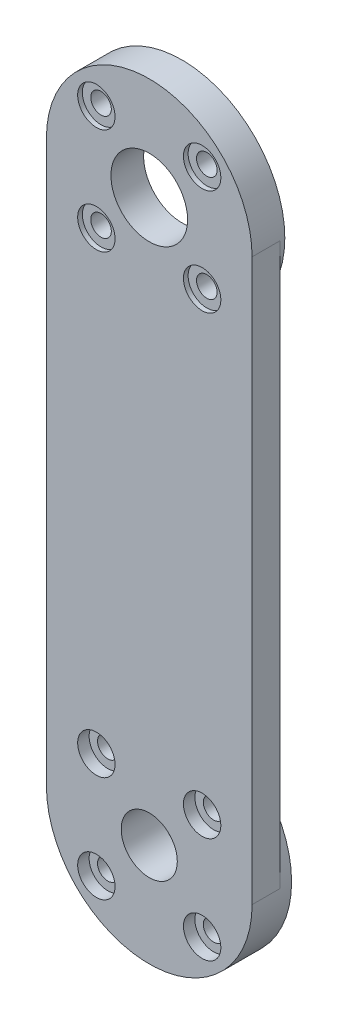
ISO-10303-21;
HEADER;
FILE_DESCRIPTION(('STEP AP214'),'2;1');
FILE_NAME('part.step','',(''),(''),'','','');
FILE_SCHEMA(('AUTOMOTIVE_DESIGN { 1 0 10303 214 1 1 1 1 }'));
ENDSEC;
DATA;
#1=APPLICATION_CONTEXT('core data for automotive mechanical design processes');
#2=APPLICATION_PROTOCOL_DEFINITION('international standard','automotive_design',2000,#1);
#3=PRODUCT_CONTEXT('',#1,'mechanical');
#4=PRODUCT('Part','Part','',(#3));
#5=PRODUCT_RELATED_PRODUCT_CATEGORY('part','',(#4));
#6=PRODUCT_DEFINITION_FORMATION('','',#4);
#7=PRODUCT_DEFINITION_CONTEXT('part definition',#1,'design');
#8=PRODUCT_DEFINITION('design','',#6,#7);
#9=PRODUCT_DEFINITION_SHAPE('','',#8);
#10=(LENGTH_UNIT() NAMED_UNIT(*) SI_UNIT(.MILLI.,.METRE.));
#11=(NAMED_UNIT(*) PLANE_ANGLE_UNIT() SI_UNIT($,.RADIAN.));
#12=(NAMED_UNIT(*) SI_UNIT($,.STERADIAN.) SOLID_ANGLE_UNIT());
#13=UNCERTAINTY_MEASURE_WITH_UNIT(LENGTH_MEASURE(1.E-05),#10,'distance_accuracy_value','');
#14=(GEOMETRIC_REPRESENTATION_CONTEXT(3) GLOBAL_UNCERTAINTY_ASSIGNED_CONTEXT((#13)) GLOBAL_UNIT_ASSIGNED_CONTEXT((#10,
#11,#12)) REPRESENTATION_CONTEXT('',''));
#15=CARTESIAN_POINT('',(0.,0.,0.));
#16=DIRECTION('',(0.,0.,1.));
#17=DIRECTION('',(1.,0.,0.));
#18=AXIS2_PLACEMENT_3D('',#15,#16,#17);
#19=CARTESIAN_POINT('',(-5.65685424949239,-35.6568542494924,-9.71028137423857));
#20=DIRECTION('',(0.,0.,1.));
#21=DIRECTION('',(1.,0.,0.));
#22=AXIS2_PLACEMENT_3D('',#19,#20,#21);
#23=CYLINDRICAL_SURFACE('',#22,1.1);
#24=CARTESIAN_POINT('',(-5.65685424949239,-35.6568542494924,-1.225));
#25=DIRECTION('',(0.,0.,1.));
#26=DIRECTION('',(1.,0.,0.));
#27=AXIS2_PLACEMENT_3D('',#24,#25,#26);
#28=CIRCLE('',#27,1.1);
#29=CARTESIAN_POINT('',(-4.55685424949239,-35.6568542494924,-1.225));
#30=VERTEX_POINT('',#29);
#31=EDGE_CURVE('E241',#30,#30,#28,.F.);
#32=ORIENTED_EDGE('',*,*,#31,.T.);
#33=EDGE_LOOP('',(#32));
#34=FACE_BOUND('',#33,.T.);
#35=CARTESIAN_POINT('',(-5.65685424949239,-35.6568542494924,1.775));
#36=DIRECTION('',(0.,0.,1.));
#37=DIRECTION('',(1.,0.,0.));
#38=AXIS2_PLACEMENT_3D('',#35,#36,#37);
#39=CIRCLE('',#38,1.1);
#40=CARTESIAN_POINT('',(-4.55685424949239,-35.6568542494924,1.775));
#41=VERTEX_POINT('',#40);
#42=EDGE_CURVE('E262',#41,#41,#39,.F.);
#43=ORIENTED_EDGE('',*,*,#42,.F.);
#44=EDGE_LOOP('',(#43));
#45=FACE_BOUND('',#44,.T.);
#46=ADVANCED_FACE('F43',(#34,#45),#23,.F.);
#47=CARTESIAN_POINT('',(-5.65685424949239,-24.3431457505076,-9.71028137423857));
#48=DIRECTION('',(0.,0.,1.));
#49=DIRECTION('',(1.,0.,0.));
#50=AXIS2_PLACEMENT_3D('',#47,#48,#49);
#51=CYLINDRICAL_SURFACE('',#50,1.1);
#52=CARTESIAN_POINT('',(-5.65685424949239,-24.3431457505076,-1.225));
#53=DIRECTION('',(0.,0.,1.));
#54=DIRECTION('',(1.,0.,0.));
#55=AXIS2_PLACEMENT_3D('',#52,#53,#54);
#56=CIRCLE('',#55,1.1);
#57=CARTESIAN_POINT('',(-4.55685424949239,-24.3431457505076,-1.225));
#58=VERTEX_POINT('',#57);
#59=EDGE_CURVE('E233',#58,#58,#56,.F.);
#60=ORIENTED_EDGE('',*,*,#59,.T.);
#61=EDGE_LOOP('',(#60));
#62=FACE_BOUND('',#61,.T.);
#63=CARTESIAN_POINT('',(-5.65685424949239,-24.3431457505076,1.775));
#64=DIRECTION('',(0.,0.,1.));
#65=DIRECTION('',(1.,0.,0.));
#66=AXIS2_PLACEMENT_3D('',#63,#64,#65);
#67=CIRCLE('',#66,1.1);
#68=CARTESIAN_POINT('',(-4.55685424949239,-24.3431457505076,1.775));
#69=VERTEX_POINT('',#68);
#70=EDGE_CURVE('E242',#69,#69,#67,.F.);
#71=ORIENTED_EDGE('',*,*,#70,.F.);
#72=EDGE_LOOP('',(#71));
#73=FACE_BOUND('',#72,.T.);
#74=ADVANCED_FACE('F295',(#62,#73),#51,.F.);
#75=CARTESIAN_POINT('',(5.65685424949243,-35.6568542494923,-9.71028137423857));
#76=DIRECTION('',(0.,0.,1.));
#77=DIRECTION('',(1.,0.,0.));
#78=AXIS2_PLACEMENT_3D('',#75,#76,#77);
#79=CYLINDRICAL_SURFACE('',#78,1.1);
#80=CARTESIAN_POINT('',(5.65685424949243,-35.6568542494923,-1.225));
#81=DIRECTION('',(0.,0.,1.));
#82=DIRECTION('',(1.,0.,0.));
#83=AXIS2_PLACEMENT_3D('',#80,#81,#82);
#84=CIRCLE('',#83,1.1);
#85=CARTESIAN_POINT('',(6.75685424949243,-35.6568542494923,-1.225));
#86=VERTEX_POINT('',#85);
#87=EDGE_CURVE('E237',#86,#86,#84,.F.);
#88=ORIENTED_EDGE('',*,*,#87,.T.);
#89=EDGE_LOOP('',(#88));
#90=FACE_BOUND('',#89,.T.);
#91=CARTESIAN_POINT('',(5.65685424949243,-35.6568542494923,1.775));
#92=DIRECTION('',(0.,0.,1.));
#93=DIRECTION('',(1.,0.,0.));
#94=AXIS2_PLACEMENT_3D('',#91,#92,#93);
#95=CIRCLE('',#94,1.1);
#96=CARTESIAN_POINT('',(6.75685424949243,-35.6568542494923,1.775));
#97=VERTEX_POINT('',#96);
#98=EDGE_CURVE('E249',#97,#97,#95,.F.);
#99=ORIENTED_EDGE('',*,*,#98,.F.);
#100=EDGE_LOOP('',(#99));
#101=FACE_BOUND('',#100,.T.);
#102=ADVANCED_FACE('F297',(#90,#101),#79,.F.);
#103=CARTESIAN_POINT('',(5.65685424949239,-24.3431457505076,-9.71028137423857));
#104=DIRECTION('',(0.,0.,1.));
#105=DIRECTION('',(1.,0.,0.));
#106=AXIS2_PLACEMENT_3D('',#103,#104,#105);
#107=CYLINDRICAL_SURFACE('',#106,1.1);
#108=CARTESIAN_POINT('',(5.65685424949239,-24.3431457505076,-1.225));
#109=DIRECTION('',(0.,0.,1.));
#110=DIRECTION('',(1.,0.,0.));
#111=AXIS2_PLACEMENT_3D('',#108,#109,#110);
#112=CIRCLE('',#111,1.1);
#113=CARTESIAN_POINT('',(6.75685424949239,-24.3431457505076,-1.225));
#114=VERTEX_POINT('',#113);
#115=EDGE_CURVE('E213',#114,#114,#112,.F.);
#116=ORIENTED_EDGE('',*,*,#115,.T.);
#117=EDGE_LOOP('',(#116));
#118=FACE_BOUND('',#117,.T.);
#119=CARTESIAN_POINT('',(5.65685424949239,-24.3431457505076,1.775));
#120=DIRECTION('',(0.,0.,1.));
#121=DIRECTION('',(1.,0.,0.));
#122=AXIS2_PLACEMENT_3D('',#119,#120,#121);
#123=CIRCLE('',#122,1.1);
#124=CARTESIAN_POINT('',(6.75685424949239,-24.3431457505076,1.775));
#125=VERTEX_POINT('',#124);
#126=EDGE_CURVE('E218',#125,#125,#123,.F.);
#127=ORIENTED_EDGE('',*,*,#126,.F.);
#128=EDGE_LOOP('',(#127));
#129=FACE_BOUND('',#128,.T.);
#130=ADVANCED_FACE('F304',(#118,#129),#107,.F.);
#131=CARTESIAN_POINT('',(-5.65685424949236,24.3431457505076,-12.0965512114594));
#132=DIRECTION('',(0.,0.,1.));
#133=DIRECTION('',(1.,0.,0.));
#134=AXIS2_PLACEMENT_3D('',#131,#132,#133);
#135=CYLINDRICAL_SURFACE('',#134,1.10000000000001);
#136=CARTESIAN_POINT('',(-5.65685424949236,24.3431457505076,-0.5));
#137=DIRECTION('',(0.,0.,1.));
#138=DIRECTION('',(1.,0.,0.));
#139=AXIS2_PLACEMENT_3D('',#136,#137,#138);
#140=CIRCLE('',#139,1.10000000000001);
#141=CARTESIAN_POINT('',(-4.55685424949235,24.3431457505076,-0.5));
#142=VERTEX_POINT('',#141);
#143=EDGE_CURVE('E163',#142,#142,#140,.F.);
#144=ORIENTED_EDGE('',*,*,#143,.T.);
#145=EDGE_LOOP('',(#144));
#146=FACE_BOUND('',#145,.T.);
#147=CARTESIAN_POINT('',(-5.65685424949236,24.3431457505076,2.5));
#148=DIRECTION('',(0.,0.,1.));
#149=DIRECTION('',(1.,0.,0.));
#150=AXIS2_PLACEMENT_3D('',#147,#148,#149);
#151=CIRCLE('',#150,1.10000000000001);
#152=CARTESIAN_POINT('',(-4.55685424949235,24.3431457505076,2.5));
#153=VERTEX_POINT('',#152);
#154=EDGE_CURVE('E175',#153,#153,#151,.F.);
#155=ORIENTED_EDGE('',*,*,#154,.F.);
#156=EDGE_LOOP('',(#155));
#157=FACE_BOUND('',#156,.T.);
#158=ADVANCED_FACE('F327',(#146,#157),#135,.F.);
#159=CARTESIAN_POINT('',(-5.65685424949243,35.6568542494923,-12.0965512114594));
#160=DIRECTION('',(0.,0.,1.));
#161=DIRECTION('',(1.,0.,0.));
#162=AXIS2_PLACEMENT_3D('',#159,#160,#161);
#163=CYLINDRICAL_SURFACE('',#162,1.10000000000001);
#164=CARTESIAN_POINT('',(-5.65685424949243,35.6568542494923,-0.5));
#165=DIRECTION('',(0.,0.,1.));
#166=DIRECTION('',(1.,0.,0.));
#167=AXIS2_PLACEMENT_3D('',#164,#165,#166);
#168=CIRCLE('',#167,1.10000000000001);
#169=CARTESIAN_POINT('',(-4.55685424949242,35.6568542494923,-0.5));
#170=VERTEX_POINT('',#169);
#171=EDGE_CURVE('E155',#170,#170,#168,.F.);
#172=ORIENTED_EDGE('',*,*,#171,.T.);
#173=EDGE_LOOP('',(#172));
#174=FACE_BOUND('',#173,.T.);
#175=CARTESIAN_POINT('',(-5.65685424949243,35.6568542494923,2.5));
#176=DIRECTION('',(0.,0.,1.));
#177=DIRECTION('',(1.,0.,0.));
#178=AXIS2_PLACEMENT_3D('',#175,#176,#177);
#179=CIRCLE('',#178,1.10000000000001);
#180=CARTESIAN_POINT('',(-4.55685424949242,35.6568542494923,2.5));
#181=VERTEX_POINT('',#180);
#182=EDGE_CURVE('E189',#181,#181,#179,.F.);
#183=ORIENTED_EDGE('',*,*,#182,.F.);
#184=EDGE_LOOP('',(#183));
#185=FACE_BOUND('',#184,.T.);
#186=ADVANCED_FACE('F359',(#174,#185),#163,.F.);
#187=CARTESIAN_POINT('',(5.65685424949246,24.3431457505077,-12.0965512114594));
#188=DIRECTION('',(0.,0.,1.));
#189=DIRECTION('',(1.,0.,0.));
#190=AXIS2_PLACEMENT_3D('',#187,#188,#189);
#191=CYLINDRICAL_SURFACE('',#190,1.10000000000001);
#192=CARTESIAN_POINT('',(5.65685424949246,24.3431457505077,-0.5));
#193=DIRECTION('',(0.,0.,1.));
#194=DIRECTION('',(1.,0.,0.));
#195=AXIS2_PLACEMENT_3D('',#192,#193,#194);
#196=CIRCLE('',#195,1.10000000000001);
#197=CARTESIAN_POINT('',(6.75685424949247,24.3431457505077,-0.5));
#198=VERTEX_POINT('',#197);
#199=EDGE_CURVE('E159',#198,#198,#196,.F.);
#200=ORIENTED_EDGE('',*,*,#199,.T.);
#201=EDGE_LOOP('',(#200));
#202=FACE_BOUND('',#201,.T.);
#203=CARTESIAN_POINT('',(5.65685424949246,24.3431457505077,2.5));
#204=DIRECTION('',(0.,0.,1.));
#205=DIRECTION('',(1.,0.,0.));
#206=AXIS2_PLACEMENT_3D('',#203,#204,#205);
#207=CIRCLE('',#206,1.10000000000001);
#208=CARTESIAN_POINT('',(6.75685424949247,24.3431457505077,2.5));
#209=VERTEX_POINT('',#208);
#210=EDGE_CURVE('E177',#209,#209,#207,.F.);
#211=ORIENTED_EDGE('',*,*,#210,.F.);
#212=EDGE_LOOP('',(#211));
#213=FACE_BOUND('',#212,.T.);
#214=ADVANCED_FACE('F363',(#202,#213),#191,.F.);
#215=CARTESIAN_POINT('',(5.65685424949235,35.6568542494924,-12.0965512114594));
#216=DIRECTION('',(0.,0.,1.));
#217=DIRECTION('',(1.,0.,0.));
#218=AXIS2_PLACEMENT_3D('',#215,#216,#217);
#219=CYLINDRICAL_SURFACE('',#218,1.10000000000001);
#220=CARTESIAN_POINT('',(5.65685424949235,35.6568542494924,-0.5));
#221=DIRECTION('',(0.,0.,1.));
#222=DIRECTION('',(1.,0.,0.));
#223=AXIS2_PLACEMENT_3D('',#220,#221,#222);
#224=CIRCLE('',#223,1.10000000000001);
#225=CARTESIAN_POINT('',(6.75685424949235,35.6568542494924,-0.5));
#226=VERTEX_POINT('',#225);
#227=EDGE_CURVE('E135',#226,#226,#224,.F.);
#228=ORIENTED_EDGE('',*,*,#227,.T.);
#229=EDGE_LOOP('',(#228));
#230=FACE_BOUND('',#229,.T.);
#231=CARTESIAN_POINT('',(5.65685424949235,35.6568542494924,2.5));
#232=DIRECTION('',(0.,0.,1.));
#233=DIRECTION('',(1.,0.,0.));
#234=AXIS2_PLACEMENT_3D('',#231,#232,#233);
#235=CIRCLE('',#234,1.10000000000001);
#236=CARTESIAN_POINT('',(6.75685424949235,35.6568542494924,2.5));
#237=VERTEX_POINT('',#236);
#238=EDGE_CURVE('E151',#237,#237,#235,.F.);
#239=ORIENTED_EDGE('',*,*,#238,.F.);
#240=EDGE_LOOP('',(#239));
#241=FACE_BOUND('',#240,.T.);
#242=ADVANCED_FACE('F367',(#230,#241),#219,.F.);
#243=CARTESIAN_POINT('',(11.,0.,3.));
#244=DIRECTION('',(1.,0.,0.));
#245=DIRECTION('',(0.,1.,0.));
#246=AXIS2_PLACEMENT_3D('',#243,#244,#245);
#247=PLANE('',#246);
#248=DIRECTION('',(0.,-1.,0.));
#249=VECTOR('',#248,1.);
#250=CARTESIAN_POINT('',(11.,0.,0.));
#251=LINE('',#250,#249);
#252=CARTESIAN_POINT('',(11.,30.,0.));
#253=VERTEX_POINT('',#252);
#254=CARTESIAN_POINT('',(11.,-30.,0.));
#255=VERTEX_POINT('',#254);
#256=EDGE_CURVE('E112',#253,#255,#251,.T.);
#257=ORIENTED_EDGE('',*,*,#256,.F.);
#258=DIRECTION('',(0.,0.,-1.));
#259=VECTOR('',#258,1.);
#260=CARTESIAN_POINT('',(11.,30.,3.));
#261=LINE('',#260,#259);
#262=CARTESIAN_POINT('',(11.,30.,3.));
#263=VERTEX_POINT('',#262);
#264=EDGE_CURVE('E47',#263,#253,#261,.T.);
#265=ORIENTED_EDGE('',*,*,#264,.F.);
#266=DIRECTION('',(0.,-1.,0.));
#267=VECTOR('',#266,1.);
#268=CARTESIAN_POINT('',(11.,0.,3.));
#269=LINE('',#268,#267);
#270=CARTESIAN_POINT('',(11.,-30.,3.));
#271=VERTEX_POINT('',#270);
#272=EDGE_CURVE('E93',#263,#271,#269,.T.);
#273=ORIENTED_EDGE('',*,*,#272,.T.);
#274=DIRECTION('',(0.,0.,-1.));
#275=VECTOR('',#274,1.);
#276=CARTESIAN_POINT('',(11.,-30.,3.));
#277=LINE('',#276,#275);
#278=EDGE_CURVE('E108',#271,#255,#277,.T.);
#279=ORIENTED_EDGE('',*,*,#278,.T.);
#280=EDGE_LOOP('',(#257,#265,#273,#279));
#281=FACE_BOUND('',#280,.T.);
#282=ADVANCED_FACE('F45',(#281),#247,.T.);
#283=CARTESIAN_POINT('',(0.,30.,3.));
#284=DIRECTION('',(0.,0.,-1.));
#285=DIRECTION('',(-1.,0.,0.));
#286=AXIS2_PLACEMENT_3D('',#283,#284,#285);
#287=CYLINDRICAL_SURFACE('',#286,11.);
#288=ORIENTED_EDGE('',*,*,#264,.T.);
#289=CARTESIAN_POINT('',(0.,30.,0.));
#290=DIRECTION('',(0.,0.,1.));
#291=DIRECTION('',(1.,0.,0.));
#292=AXIS2_PLACEMENT_3D('',#289,#290,#291);
#293=CIRCLE('',#292,11.);
#294=CARTESIAN_POINT('',(-11.,30.,0.));
#295=VERTEX_POINT('',#294);
#296=EDGE_CURVE('E12',#295,#253,#293,.T.);
#297=ORIENTED_EDGE('',*,*,#296,.F.);
#298=DIRECTION('',(0.,0.,-1.));
#299=VECTOR('',#298,1.);
#300=CARTESIAN_POINT('',(-11.,30.,3.));
#301=LINE('',#300,#299);
#302=CARTESIAN_POINT('',(-11.,30.,3.));
#303=VERTEX_POINT('',#302);
#304=EDGE_CURVE('E96',#303,#295,#301,.T.);
#305=ORIENTED_EDGE('',*,*,#304,.F.);
#306=CARTESIAN_POINT('',(0.,30.,3.));
#307=DIRECTION('',(0.,0.,1.));
#308=DIRECTION('',(1.,0.,0.));
#309=AXIS2_PLACEMENT_3D('',#306,#307,#308);
#310=CIRCLE('',#309,11.);
#311=EDGE_CURVE('E87',#263,#303,#310,.T.);
#312=ORIENTED_EDGE('',*,*,#311,.F.);
#313=EDGE_LOOP('',(#288,#297,#305,#312));
#314=FACE_BOUND('',#313,.T.);
#315=CARTESIAN_POINT('',(0.,30.,-0.5));
#316=DIRECTION('',(0.,0.,1.));
#317=DIRECTION('',(1.,0.,0.));
#318=AXIS2_PLACEMENT_3D('',#315,#316,#317);
#319=CIRCLE('',#318,11.);
#320=CARTESIAN_POINT('',(11.,30.,-0.5));
#321=VERTEX_POINT('',#320);
#322=EDGE_CURVE('E116',#321,#321,#319,.T.);
#323=ORIENTED_EDGE('',*,*,#322,.T.);
#324=EDGE_LOOP('',(#323));
#325=FACE_BOUND('',#324,.T.);
#326=ADVANCED_FACE('F97',(#314,#325),#287,.T.);
#327=CARTESIAN_POINT('',(-11.,0.,3.));
#328=DIRECTION('',(1.,0.,0.));
#329=DIRECTION('',(0.,1.,0.));
#330=AXIS2_PLACEMENT_3D('',#327,#328,#329);
#331=PLANE('',#330);
#332=DIRECTION('',(0.,-1.,0.));
#333=VECTOR('',#332,1.);
#334=CARTESIAN_POINT('',(-11.,0.,0.));
#335=LINE('',#334,#333);
#336=CARTESIAN_POINT('',(-11.,-30.,0.));
#337=VERTEX_POINT('',#336);
#338=EDGE_CURVE('E115',#295,#337,#335,.T.);
#339=ORIENTED_EDGE('',*,*,#338,.T.);
#340=DIRECTION('',(0.,0.,-1.));
#341=VECTOR('',#340,1.);
#342=CARTESIAN_POINT('',(-11.,-30.,3.));
#343=LINE('',#342,#341);
#344=CARTESIAN_POINT('',(-11.,-30.,3.));
#345=VERTEX_POINT('',#344);
#346=EDGE_CURVE('E102',#345,#337,#343,.T.);
#347=ORIENTED_EDGE('',*,*,#346,.F.);
#348=DIRECTION('',(0.,-1.,0.));
#349=VECTOR('',#348,1.);
#350=CARTESIAN_POINT('',(-11.,0.,3.));
#351=LINE('',#350,#349);
#352=EDGE_CURVE('E90',#303,#345,#351,.T.);
#353=ORIENTED_EDGE('',*,*,#352,.F.);
#354=ORIENTED_EDGE('',*,*,#304,.T.);
#355=EDGE_LOOP('',(#339,#347,#353,#354));
#356=FACE_BOUND('',#355,.T.);
#357=ADVANCED_FACE('F103',(#356),#331,.F.);
#358=CARTESIAN_POINT('',(0.,-30.,3.));
#359=DIRECTION('',(0.,0.,-1.));
#360=DIRECTION('',(-1.,0.,0.));
#361=AXIS2_PLACEMENT_3D('',#358,#359,#360);
#362=CYLINDRICAL_SURFACE('',#361,11.);
#363=ORIENTED_EDGE('',*,*,#346,.T.);
#364=CARTESIAN_POINT('',(0.,-30.,0.));
#365=DIRECTION('',(0.,0.,1.));
#366=DIRECTION('',(1.,0.,0.));
#367=AXIS2_PLACEMENT_3D('',#364,#365,#366);
#368=CIRCLE('',#367,11.);
#369=EDGE_CURVE('E126',#255,#337,#368,.T.);
#370=ORIENTED_EDGE('',*,*,#369,.F.);
#371=ORIENTED_EDGE('',*,*,#278,.F.);
#372=CARTESIAN_POINT('',(0.,-30.,3.));
#373=DIRECTION('',(0.,0.,1.));
#374=DIRECTION('',(1.,0.,0.));
#375=AXIS2_PLACEMENT_3D('',#372,#373,#374);
#376=CIRCLE('',#375,11.);
#377=EDGE_CURVE('E62',#345,#271,#376,.T.);
#378=ORIENTED_EDGE('',*,*,#377,.F.);
#379=EDGE_LOOP('',(#363,#370,#371,#378));
#380=FACE_BOUND('',#379,.T.);
#381=CARTESIAN_POINT('',(0.,-30.,-1.225));
#382=DIRECTION('',(0.,0.,1.));
#383=DIRECTION('',(1.,0.,0.));
#384=AXIS2_PLACEMENT_3D('',#381,#382,#383);
#385=CIRCLE('',#384,11.);
#386=CARTESIAN_POINT('',(11.,-30.,-1.225));
#387=VERTEX_POINT('',#386);
#388=EDGE_CURVE('E181',#387,#387,#385,.T.);
#389=ORIENTED_EDGE('',*,*,#388,.T.);
#390=EDGE_LOOP('',(#389));
#391=FACE_BOUND('',#390,.T.);
#392=ADVANCED_FACE('F124',(#380,#391),#362,.T.);
#393=CARTESIAN_POINT('',(0.,0.,3.));
#394=DIRECTION('',(0.,0.,1.));
#395=DIRECTION('',(1.,0.,0.));
#396=AXIS2_PLACEMENT_3D('',#393,#394,#395);
#397=PLANE('',#396);
#398=CARTESIAN_POINT('',(-5.65685424949239,-24.3431457505076,3.));
#399=DIRECTION('',(0.,0.,1.));
#400=DIRECTION('',(0.,1.,0.));
#401=AXIS2_PLACEMENT_3D('',#398,#399,#400);
#402=CIRCLE('',#401,2.);
#403=CARTESIAN_POINT('',(-5.65685424949239,-22.3431457505076,3.));
#404=VERTEX_POINT('',#403);
#405=EDGE_CURVE('E266',#404,#404,#402,.T.);
#406=ORIENTED_EDGE('',*,*,#405,.F.);
#407=EDGE_LOOP('',(#406));
#408=FACE_BOUND('',#407,.T.);
#409=CARTESIAN_POINT('',(-5.65685424949239,-35.6568542494924,3.));
#410=DIRECTION('',(0.,0.,1.));
#411=DIRECTION('',(-1.,0.,0.));
#412=AXIS2_PLACEMENT_3D('',#409,#410,#411);
#413=CIRCLE('',#412,2.);
#414=CARTESIAN_POINT('',(-7.65685424949239,-35.6568542494924,3.));
#415=VERTEX_POINT('',#414);
#416=EDGE_CURVE('E253',#415,#415,#413,.T.);
#417=ORIENTED_EDGE('',*,*,#416,.F.);
#418=EDGE_LOOP('',(#417));
#419=FACE_BOUND('',#418,.T.);
#420=CARTESIAN_POINT('',(5.65685424949243,-35.6568542494923,3.));
#421=DIRECTION('',(0.,0.,1.));
#422=DIRECTION('',(0.,-1.,0.));
#423=AXIS2_PLACEMENT_3D('',#420,#421,#422);
#424=CIRCLE('',#423,2.);
#425=CARTESIAN_POINT('',(5.65685424949245,-37.6568542494923,3.));
#426=VERTEX_POINT('',#425);
#427=EDGE_CURVE('E255',#426,#426,#424,.T.);
#428=ORIENTED_EDGE('',*,*,#427,.F.);
#429=EDGE_LOOP('',(#428));
#430=FACE_BOUND('',#429,.T.);
#431=CARTESIAN_POINT('',(5.65685424949239,-24.3431457505076,3.));
#432=DIRECTION('',(0.,0.,1.));
#433=DIRECTION('',(1.,0.,0.));
#434=AXIS2_PLACEMENT_3D('',#431,#432,#433);
#435=CIRCLE('',#434,2.);
#436=CARTESIAN_POINT('',(7.65685424949239,-24.3431457505076,3.));
#437=VERTEX_POINT('',#436);
#438=EDGE_CURVE('E229',#437,#437,#435,.T.);
#439=ORIENTED_EDGE('',*,*,#438,.F.);
#440=EDGE_LOOP('',(#439));
#441=FACE_BOUND('',#440,.T.);
#442=CARTESIAN_POINT('',(0.,-30.,3.));
#443=DIRECTION('',(0.,0.,1.));
#444=DIRECTION('',(1.,0.,0.));
#445=AXIS2_PLACEMENT_3D('',#442,#443,#444);
#446=CIRCLE('',#445,3.);
#447=CARTESIAN_POINT('',(3.,-30.,3.));
#448=VERTEX_POINT('',#447);
#449=EDGE_CURVE('E217',#448,#448,#446,.T.);
#450=ORIENTED_EDGE('',*,*,#449,.F.);
#451=EDGE_LOOP('',(#450));
#452=FACE_BOUND('',#451,.T.);
#453=CARTESIAN_POINT('',(-5.65685424949243,35.6568542494923,3.));
#454=DIRECTION('',(0.,0.,1.));
#455=DIRECTION('',(0.,1.,0.));
#456=AXIS2_PLACEMENT_3D('',#453,#454,#455);
#457=CIRCLE('',#456,2.);
#458=CARTESIAN_POINT('',(-5.65685424949243,37.6568542494923,3.));
#459=VERTEX_POINT('',#458);
#460=EDGE_CURVE('E200',#459,#459,#457,.T.);
#461=ORIENTED_EDGE('',*,*,#460,.F.);
#462=EDGE_LOOP('',(#461));
#463=FACE_BOUND('',#462,.T.);
#464=CARTESIAN_POINT('',(-5.65685424949236,24.3431457505076,3.));
#465=DIRECTION('',(0.,0.,1.));
#466=DIRECTION('',(-1.,0.,0.));
#467=AXIS2_PLACEMENT_3D('',#464,#465,#466);
#468=CIRCLE('',#467,2.);
#469=CARTESIAN_POINT('',(-7.65685424949236,24.3431457505076,3.));
#470=VERTEX_POINT('',#469);
#471=EDGE_CURVE('E190',#470,#470,#468,.T.);
#472=ORIENTED_EDGE('',*,*,#471,.F.);
#473=EDGE_LOOP('',(#472));
#474=FACE_BOUND('',#473,.T.);
#475=CARTESIAN_POINT('',(5.65685424949246,24.3431457505077,3.));
#476=DIRECTION('',(0.,0.,1.));
#477=DIRECTION('',(0.,-1.,0.));
#478=AXIS2_PLACEMENT_3D('',#475,#476,#477);
#479=CIRCLE('',#478,2.);
#480=CARTESIAN_POINT('',(5.65685424949248,22.3431457505077,3.));
#481=VERTEX_POINT('',#480);
#482=EDGE_CURVE('E176',#481,#481,#479,.T.);
#483=ORIENTED_EDGE('',*,*,#482,.F.);
#484=EDGE_LOOP('',(#483));
#485=FACE_BOUND('',#484,.T.);
#486=CARTESIAN_POINT('',(5.65685424949235,35.6568542494924,3.));
#487=DIRECTION('',(0.,0.,1.));
#488=DIRECTION('',(1.,0.,0.));
#489=AXIS2_PLACEMENT_3D('',#486,#487,#488);
#490=CIRCLE('',#489,2.);
#491=CARTESIAN_POINT('',(7.65685424949235,35.6568542494924,3.));
#492=VERTEX_POINT('',#491);
#493=EDGE_CURVE('E150',#492,#492,#490,.T.);
#494=ORIENTED_EDGE('',*,*,#493,.F.);
#495=EDGE_LOOP('',(#494));
#496=FACE_BOUND('',#495,.T.);
#497=CARTESIAN_POINT('',(0.,30.,3.));
#498=DIRECTION('',(0.,0.,1.));
#499=DIRECTION('',(1.,0.,0.));
#500=AXIS2_PLACEMENT_3D('',#497,#498,#499);
#501=CIRCLE('',#500,4.1);
#502=CARTESIAN_POINT('',(4.1,30.,3.));
#503=VERTEX_POINT('',#502);
#504=EDGE_CURVE('E139',#503,#503,#501,.T.);
#505=ORIENTED_EDGE('',*,*,#504,.F.);
#506=EDGE_LOOP('',(#505));
#507=FACE_BOUND('',#506,.T.);
#508=ORIENTED_EDGE('',*,*,#272,.F.);
#509=ORIENTED_EDGE('',*,*,#311,.T.);
#510=ORIENTED_EDGE('',*,*,#352,.T.);
#511=ORIENTED_EDGE('',*,*,#377,.T.);
#512=EDGE_LOOP('',(#508,#509,#510,#511));
#513=FACE_BOUND('',#512,.T.);
#514=ADVANCED_FACE('F88',(#408,#419,#430,#441,#452,#463,#474,#485,#496,#507,#513),#397,.T.);
#515=CARTESIAN_POINT('',(0.,0.,0.));
#516=DIRECTION('',(0.,0.,1.));
#517=DIRECTION('',(1.,0.,0.));
#518=AXIS2_PLACEMENT_3D('',#515,#516,#517);
#519=PLANE('',#518);
#520=ORIENTED_EDGE('',*,*,#256,.T.);
#521=ORIENTED_EDGE('',*,*,#369,.T.);
#522=ORIENTED_EDGE('',*,*,#338,.F.);
#523=ORIENTED_EDGE('',*,*,#296,.T.);
#524=EDGE_LOOP('',(#520,#521,#522,#523));
#525=FACE_BOUND('',#524,.T.);
#526=ADVANCED_FACE('F386',(#525),#519,.F.);
#527=CARTESIAN_POINT('',(0.,0.,-0.5));
#528=DIRECTION('',(0.,0.,1.));
#529=DIRECTION('',(1.,0.,0.));
#530=AXIS2_PLACEMENT_3D('',#527,#528,#529);
#531=PLANE('',#530);
#532=ORIENTED_EDGE('',*,*,#199,.F.);
#533=EDGE_LOOP('',(#532));
#534=FACE_BOUND('',#533,.T.);
#535=ORIENTED_EDGE('',*,*,#171,.F.);
#536=EDGE_LOOP('',(#535));
#537=FACE_BOUND('',#536,.T.);
#538=ORIENTED_EDGE('',*,*,#143,.F.);
#539=EDGE_LOOP('',(#538));
#540=FACE_BOUND('',#539,.T.);
#541=CARTESIAN_POINT('',(0.,30.,-0.5));
#542=DIRECTION('',(0.,0.,1.));
#543=DIRECTION('',(1.,0.,0.));
#544=AXIS2_PLACEMENT_3D('',#541,#542,#543);
#545=CIRCLE('',#544,4.1);
#546=CARTESIAN_POINT('',(4.1,30.,-0.5));
#547=VERTEX_POINT('',#546);
#548=EDGE_CURVE('E134',#547,#547,#545,.F.);
#549=ORIENTED_EDGE('',*,*,#548,.F.);
#550=EDGE_LOOP('',(#549));
#551=FACE_BOUND('',#550,.T.);
#552=ORIENTED_EDGE('',*,*,#227,.F.);
#553=EDGE_LOOP('',(#552));
#554=FACE_BOUND('',#553,.T.);
#555=ORIENTED_EDGE('',*,*,#322,.F.);
#556=EDGE_LOOP('',(#555));
#557=FACE_BOUND('',#556,.T.);
#558=ADVANCED_FACE('F379',(#534,#537,#540,#551,#554,#557),#531,.F.);
#559=CARTESIAN_POINT('',(0.,30.,-12.0965512114594));
#560=DIRECTION('',(0.,0.,1.));
#561=DIRECTION('',(1.,0.,0.));
#562=AXIS2_PLACEMENT_3D('',#559,#560,#561);
#563=CYLINDRICAL_SURFACE('',#562,4.1);
#564=ORIENTED_EDGE('',*,*,#548,.T.);
#565=EDGE_LOOP('',(#564));
#566=FACE_BOUND('',#565,.T.);
#567=ORIENTED_EDGE('',*,*,#504,.T.);
#568=EDGE_LOOP('',(#567));
#569=FACE_BOUND('',#568,.T.);
#570=ADVANCED_FACE('F372',(#566,#569),#563,.F.);
#571=CARTESIAN_POINT('',(5.65685424949235,35.6568542494924,-6.15685424949239));
#572=DIRECTION('',(0.,0.,1.));
#573=DIRECTION('',(1.,0.,0.));
#574=AXIS2_PLACEMENT_3D('',#571,#572,#573);
#575=CYLINDRICAL_SURFACE('',#574,2.);
#576=CARTESIAN_POINT('',(5.65685424949235,35.6568542494924,2.5));
#577=DIRECTION('',(0.,0.,1.));
#578=DIRECTION('',(1.,0.,0.));
#579=AXIS2_PLACEMENT_3D('',#576,#577,#578);
#580=CIRCLE('',#579,2.);
#581=CARTESIAN_POINT('',(7.65685424949235,35.6568542494924,2.5));
#582=VERTEX_POINT('',#581);
#583=EDGE_CURVE('E140',#582,#582,#580,.F.);
#584=ORIENTED_EDGE('',*,*,#583,.T.);
#585=EDGE_LOOP('',(#584));
#586=FACE_BOUND('',#585,.T.);
#587=ORIENTED_EDGE('',*,*,#493,.T.);
#588=EDGE_LOOP('',(#587));
#589=FACE_BOUND('',#588,.T.);
#590=ADVANCED_FACE('F369',(#586,#589),#575,.F.);
#591=CARTESIAN_POINT('',(0.,0.,2.5));
#592=DIRECTION('',(0.,0.,1.));
#593=DIRECTION('',(1.,0.,0.));
#594=AXIS2_PLACEMENT_3D('',#591,#592,#593);
#595=PLANE('',#594);
#596=ORIENTED_EDGE('',*,*,#583,.F.);
#597=EDGE_LOOP('',(#596));
#598=FACE_BOUND('',#597,.T.);
#599=ORIENTED_EDGE('',*,*,#238,.T.);
#600=EDGE_LOOP('',(#599));
#601=FACE_BOUND('',#600,.T.);
#602=ADVANCED_FACE('F352',(#598,#601),#595,.T.);
#603=CARTESIAN_POINT('',(5.65685424949246,24.3431457505077,-6.15685424949239));
#604=DIRECTION('',(0.,0.,1.));
#605=DIRECTION('',(1.,0.,0.));
#606=AXIS2_PLACEMENT_3D('',#603,#604,#605);
#607=CYLINDRICAL_SURFACE('',#606,2.);
#608=CARTESIAN_POINT('',(5.65685424949246,24.3431457505077,2.5));
#609=DIRECTION('',(0.,0.,1.));
#610=DIRECTION('',(1.,0.,0.));
#611=AXIS2_PLACEMENT_3D('',#608,#609,#610);
#612=CIRCLE('',#611,2.);
#613=CARTESIAN_POINT('',(7.65685424949246,24.3431457505077,2.5));
#614=VERTEX_POINT('',#613);
#615=EDGE_CURVE('E171',#614,#614,#612,.F.);
#616=ORIENTED_EDGE('',*,*,#615,.T.);
#617=EDGE_LOOP('',(#616));
#618=FACE_BOUND('',#617,.T.);
#619=ORIENTED_EDGE('',*,*,#482,.T.);
#620=EDGE_LOOP('',(#619));
#621=FACE_BOUND('',#620,.T.);
#622=ADVANCED_FACE('F349',(#618,#621),#607,.F.);
#623=CARTESIAN_POINT('',(0.,0.,2.5));
#624=DIRECTION('',(0.,0.,1.));
#625=DIRECTION('',(1.,0.,0.));
#626=AXIS2_PLACEMENT_3D('',#623,#624,#625);
#627=PLANE('',#626);
#628=ORIENTED_EDGE('',*,*,#615,.F.);
#629=EDGE_LOOP('',(#628));
#630=FACE_BOUND('',#629,.T.);
#631=ORIENTED_EDGE('',*,*,#210,.T.);
#632=EDGE_LOOP('',(#631));
#633=FACE_BOUND('',#632,.T.);
#634=ADVANCED_FACE('F337',(#630,#633),#627,.T.);
#635=CARTESIAN_POINT('',(-5.65685424949243,35.6568542494923,-6.15685424949239));
#636=DIRECTION('',(0.,0.,1.));
#637=DIRECTION('',(1.,0.,0.));
#638=AXIS2_PLACEMENT_3D('',#635,#636,#637);
#639=CYLINDRICAL_SURFACE('',#638,2.);
#640=CARTESIAN_POINT('',(-5.65685424949243,35.6568542494923,2.5));
#641=DIRECTION('',(0.,0.,1.));
#642=DIRECTION('',(1.,0.,0.));
#643=AXIS2_PLACEMENT_3D('',#640,#641,#642);
#644=CIRCLE('',#643,2.);
#645=CARTESIAN_POINT('',(-3.65685424949242,35.6568542494923,2.5));
#646=VERTEX_POINT('',#645);
#647=EDGE_CURVE('E164',#646,#646,#644,.F.);
#648=ORIENTED_EDGE('',*,*,#647,.T.);
#649=EDGE_LOOP('',(#648));
#650=FACE_BOUND('',#649,.T.);
#651=ORIENTED_EDGE('',*,*,#460,.T.);
#652=EDGE_LOOP('',(#651));
#653=FACE_BOUND('',#652,.T.);
#654=ADVANCED_FACE('F333',(#650,#653),#639,.F.);
#655=CARTESIAN_POINT('',(0.,0.,2.5));
#656=DIRECTION('',(0.,0.,1.));
#657=DIRECTION('',(1.,0.,0.));
#658=AXIS2_PLACEMENT_3D('',#655,#656,#657);
#659=PLANE('',#658);
#660=ORIENTED_EDGE('',*,*,#647,.F.);
#661=EDGE_LOOP('',(#660));
#662=FACE_BOUND('',#661,.T.);
#663=ORIENTED_EDGE('',*,*,#182,.T.);
#664=EDGE_LOOP('',(#663));
#665=FACE_BOUND('',#664,.T.);
#666=ADVANCED_FACE('F336',(#662,#665),#659,.T.);
#667=CARTESIAN_POINT('',(-5.65685424949236,24.3431457505076,-6.15685424949239));
#668=DIRECTION('',(0.,0.,1.));
#669=DIRECTION('',(1.,0.,0.));
#670=AXIS2_PLACEMENT_3D('',#667,#668,#669);
#671=CYLINDRICAL_SURFACE('',#670,2.);
#672=CARTESIAN_POINT('',(-5.65685424949236,24.3431457505076,2.5));
#673=DIRECTION('',(0.,0.,1.));
#674=DIRECTION('',(1.,0.,0.));
#675=AXIS2_PLACEMENT_3D('',#672,#673,#674);
#676=CIRCLE('',#675,2.);
#677=CARTESIAN_POINT('',(-3.65685424949235,24.3431457505076,2.5));
#678=VERTEX_POINT('',#677);
#679=EDGE_CURVE('E185',#678,#678,#676,.F.);
#680=ORIENTED_EDGE('',*,*,#679,.T.);
#681=EDGE_LOOP('',(#680));
#682=FACE_BOUND('',#681,.T.);
#683=ORIENTED_EDGE('',*,*,#471,.T.);
#684=EDGE_LOOP('',(#683));
#685=FACE_BOUND('',#684,.T.);
#686=ADVANCED_FACE('F341',(#682,#685),#671,.F.);
#687=CARTESIAN_POINT('',(0.,0.,2.5));
#688=DIRECTION('',(0.,0.,1.));
#689=DIRECTION('',(1.,0.,0.));
#690=AXIS2_PLACEMENT_3D('',#687,#688,#689);
#691=PLANE('',#690);
#692=ORIENTED_EDGE('',*,*,#679,.F.);
#693=EDGE_LOOP('',(#692));
#694=FACE_BOUND('',#693,.T.);
#695=ORIENTED_EDGE('',*,*,#154,.T.);
#696=EDGE_LOOP('',(#695));
#697=FACE_BOUND('',#696,.T.);
#698=ADVANCED_FACE('F331',(#694,#697),#691,.T.);
#699=CARTESIAN_POINT('',(0.,0.,-1.225));
#700=DIRECTION('',(0.,0.,1.));
#701=DIRECTION('',(1.,0.,0.));
#702=AXIS2_PLACEMENT_3D('',#699,#700,#701);
#703=PLANE('',#702);
#704=ORIENTED_EDGE('',*,*,#87,.F.);
#705=EDGE_LOOP('',(#704));
#706=FACE_BOUND('',#705,.T.);
#707=ORIENTED_EDGE('',*,*,#59,.F.);
#708=EDGE_LOOP('',(#707));
#709=FACE_BOUND('',#708,.T.);
#710=ORIENTED_EDGE('',*,*,#31,.F.);
#711=EDGE_LOOP('',(#710));
#712=FACE_BOUND('',#711,.T.);
#713=CARTESIAN_POINT('',(0.,-30.,-1.225));
#714=DIRECTION('',(0.,0.,1.));
#715=DIRECTION('',(1.,0.,0.));
#716=AXIS2_PLACEMENT_3D('',#713,#714,#715);
#717=CIRCLE('',#716,3.);
#718=CARTESIAN_POINT('',(3.,-30.,-1.225));
#719=VERTEX_POINT('',#718);
#720=EDGE_CURVE('E209',#719,#719,#717,.F.);
#721=ORIENTED_EDGE('',*,*,#720,.F.);
#722=EDGE_LOOP('',(#721));
#723=FACE_BOUND('',#722,.T.);
#724=ORIENTED_EDGE('',*,*,#115,.F.);
#725=EDGE_LOOP('',(#724));
#726=FACE_BOUND('',#725,.T.);
#727=ORIENTED_EDGE('',*,*,#388,.F.);
#728=EDGE_LOOP('',(#727));
#729=FACE_BOUND('',#728,.T.);
#730=ADVANCED_FACE('F323',(#706,#709,#712,#723,#726,#729),#703,.F.);
#731=CARTESIAN_POINT('',(0.,-30.,-9.71028137423857));
#732=DIRECTION('',(0.,0.,1.));
#733=DIRECTION('',(1.,0.,0.));
#734=AXIS2_PLACEMENT_3D('',#731,#732,#733);
#735=CYLINDRICAL_SURFACE('',#734,3.);
#736=ORIENTED_EDGE('',*,*,#720,.T.);
#737=EDGE_LOOP('',(#736));
#738=FACE_BOUND('',#737,.T.);
#739=ORIENTED_EDGE('',*,*,#449,.T.);
#740=EDGE_LOOP('',(#739));
#741=FACE_BOUND('',#740,.T.);
#742=ADVANCED_FACE('F319',(#738,#741),#735,.F.);
#743=CARTESIAN_POINT('',(5.65685424949239,-24.3431457505076,-6.88185424949239));
#744=DIRECTION('',(0.,0.,1.));
#745=DIRECTION('',(1.,0.,0.));
#746=AXIS2_PLACEMENT_3D('',#743,#744,#745);
#747=CYLINDRICAL_SURFACE('',#746,2.);
#748=CARTESIAN_POINT('',(5.65685424949239,-24.3431457505076,1.775));
#749=DIRECTION('',(0.,0.,1.));
#750=DIRECTION('',(1.,0.,0.));
#751=AXIS2_PLACEMENT_3D('',#748,#749,#750);
#752=CIRCLE('',#751,2.);
#753=CARTESIAN_POINT('',(7.65685424949239,-24.3431457505076,1.775));
#754=VERTEX_POINT('',#753);
#755=EDGE_CURVE('E228',#754,#754,#752,.F.);
#756=ORIENTED_EDGE('',*,*,#755,.T.);
#757=EDGE_LOOP('',(#756));
#758=FACE_BOUND('',#757,.T.);
#759=ORIENTED_EDGE('',*,*,#438,.T.);
#760=EDGE_LOOP('',(#759));
#761=FACE_BOUND('',#760,.T.);
#762=ADVANCED_FACE('F315',(#758,#761),#747,.F.);
#763=CARTESIAN_POINT('',(0.,0.,1.775));
#764=DIRECTION('',(0.,0.,1.));
#765=DIRECTION('',(1.,0.,0.));
#766=AXIS2_PLACEMENT_3D('',#763,#764,#765);
#767=PLANE('',#766);
#768=ORIENTED_EDGE('',*,*,#755,.F.);
#769=EDGE_LOOP('',(#768));
#770=FACE_BOUND('',#769,.T.);
#771=ORIENTED_EDGE('',*,*,#126,.T.);
#772=EDGE_LOOP('',(#771));
#773=FACE_BOUND('',#772,.T.);
#774=ADVANCED_FACE('F311',(#770,#773),#767,.T.);
#775=CARTESIAN_POINT('',(5.65685424949243,-35.6568542494923,-6.88185424949239));
#776=DIRECTION('',(0.,0.,1.));
#777=DIRECTION('',(1.,0.,0.));
#778=AXIS2_PLACEMENT_3D('',#775,#776,#777);
#779=CYLINDRICAL_SURFACE('',#778,2.);
#780=CARTESIAN_POINT('',(5.65685424949243,-35.6568542494923,1.775));
#781=DIRECTION('',(0.,0.,1.));
#782=DIRECTION('',(1.,0.,0.));
#783=AXIS2_PLACEMENT_3D('',#780,#781,#782);
#784=CIRCLE('',#783,2.);
#785=CARTESIAN_POINT('',(7.65685424949243,-35.6568542494923,1.775));
#786=VERTEX_POINT('',#785);
#787=EDGE_CURVE('E254',#786,#786,#784,.F.);
#788=ORIENTED_EDGE('',*,*,#787,.T.);
#789=EDGE_LOOP('',(#788));
#790=FACE_BOUND('',#789,.T.);
#791=ORIENTED_EDGE('',*,*,#427,.T.);
#792=EDGE_LOOP('',(#791));
#793=FACE_BOUND('',#792,.T.);
#794=ADVANCED_FACE('F314',(#790,#793),#779,.F.);
#795=CARTESIAN_POINT('',(0.,0.,1.775));
#796=DIRECTION('',(0.,0.,1.));
#797=DIRECTION('',(1.,0.,0.));
#798=AXIS2_PLACEMENT_3D('',#795,#796,#797);
#799=PLANE('',#798);
#800=ORIENTED_EDGE('',*,*,#787,.F.);
#801=EDGE_LOOP('',(#800));
#802=FACE_BOUND('',#801,.T.);
#803=ORIENTED_EDGE('',*,*,#98,.T.);
#804=EDGE_LOOP('',(#803));
#805=FACE_BOUND('',#804,.T.);
#806=ADVANCED_FACE('F463',(#802,#805),#799,.T.);
#807=CARTESIAN_POINT('',(-5.65685424949239,-24.3431457505076,-6.88185424949239));
#808=DIRECTION('',(0.,0.,1.));
#809=DIRECTION('',(1.,0.,0.));
#810=AXIS2_PLACEMENT_3D('',#807,#808,#809);
#811=CYLINDRICAL_SURFACE('',#810,2.);
#812=CARTESIAN_POINT('',(-5.65685424949239,-24.3431457505076,1.775));
#813=DIRECTION('',(0.,0.,1.));
#814=DIRECTION('',(1.,0.,0.));
#815=AXIS2_PLACEMENT_3D('',#812,#813,#814);
#816=CIRCLE('',#815,2.);
#817=CARTESIAN_POINT('',(-3.65685424949239,-24.3431457505076,1.775));
#818=VERTEX_POINT('',#817);
#819=EDGE_CURVE('E277',#818,#818,#816,.F.);
#820=ORIENTED_EDGE('',*,*,#819,.T.);
#821=EDGE_LOOP('',(#820));
#822=FACE_BOUND('',#821,.T.);
#823=ORIENTED_EDGE('',*,*,#405,.T.);
#824=EDGE_LOOP('',(#823));
#825=FACE_BOUND('',#824,.T.);
#826=ADVANCED_FACE('F285',(#822,#825),#811,.F.);
#827=CARTESIAN_POINT('',(0.,0.,1.775));
#828=DIRECTION('',(0.,0.,1.));
#829=DIRECTION('',(1.,0.,0.));
#830=AXIS2_PLACEMENT_3D('',#827,#828,#829);
#831=PLANE('',#830);
#832=ORIENTED_EDGE('',*,*,#819,.F.);
#833=EDGE_LOOP('',(#832));
#834=FACE_BOUND('',#833,.T.);
#835=ORIENTED_EDGE('',*,*,#70,.T.);
#836=EDGE_LOOP('',(#835));
#837=FACE_BOUND('',#836,.T.);
#838=ADVANCED_FACE('F288',(#834,#837),#831,.T.);
#839=CARTESIAN_POINT('',(-5.65685424949239,-35.6568542494924,-6.88185424949239));
#840=DIRECTION('',(0.,0.,1.));
#841=DIRECTION('',(1.,0.,0.));
#842=AXIS2_PLACEMENT_3D('',#839,#840,#841);
#843=CYLINDRICAL_SURFACE('',#842,2.);
#844=CARTESIAN_POINT('',(-5.65685424949239,-35.6568542494924,1.775));
#845=DIRECTION('',(0.,0.,1.));
#846=DIRECTION('',(1.,0.,0.));
#847=AXIS2_PLACEMENT_3D('',#844,#845,#846);
#848=CIRCLE('',#847,2.);
#849=CARTESIAN_POINT('',(-3.65685424949239,-35.6568542494924,1.775));
#850=VERTEX_POINT('',#849);
#851=EDGE_CURVE('E267',#850,#850,#848,.F.);
#852=ORIENTED_EDGE('',*,*,#851,.T.);
#853=EDGE_LOOP('',(#852));
#854=FACE_BOUND('',#853,.T.);
#855=ORIENTED_EDGE('',*,*,#416,.T.);
#856=EDGE_LOOP('',(#855));
#857=FACE_BOUND('',#856,.T.);
#858=ADVANCED_FACE('F291',(#854,#857),#843,.F.);
#859=CARTESIAN_POINT('',(0.,0.,1.775));
#860=DIRECTION('',(0.,0.,1.));
#861=DIRECTION('',(1.,0.,0.));
#862=AXIS2_PLACEMENT_3D('',#859,#860,#861);
#863=PLANE('',#862);
#864=ORIENTED_EDGE('',*,*,#851,.F.);
#865=EDGE_LOOP('',(#864));
#866=FACE_BOUND('',#865,.T.);
#867=ORIENTED_EDGE('',*,*,#42,.T.);
#868=EDGE_LOOP('',(#867));
#869=FACE_BOUND('',#868,.T.);
#870=ADVANCED_FACE('F496',(#866,#869),#863,.T.);
#871=CLOSED_SHELL('',(#46,#74,#102,#130,#158,#186,#214,#242,#282,#326,#357,#392,#514,#526,#558,
#570,#590,#602,#622,#634,#654,#666,#686,#698,#730,#742,#762,#774,#794,#806,#826,#838,#858,#870));
#872=MANIFOLD_SOLID_BREP('B2',#871);
#873=ADVANCED_BREP_SHAPE_REPRESENTATION('',(#18,#872),#14);
#874=SHAPE_DEFINITION_REPRESENTATION(#9,#873);
ENDSEC;
END-ISO-10303-21;
